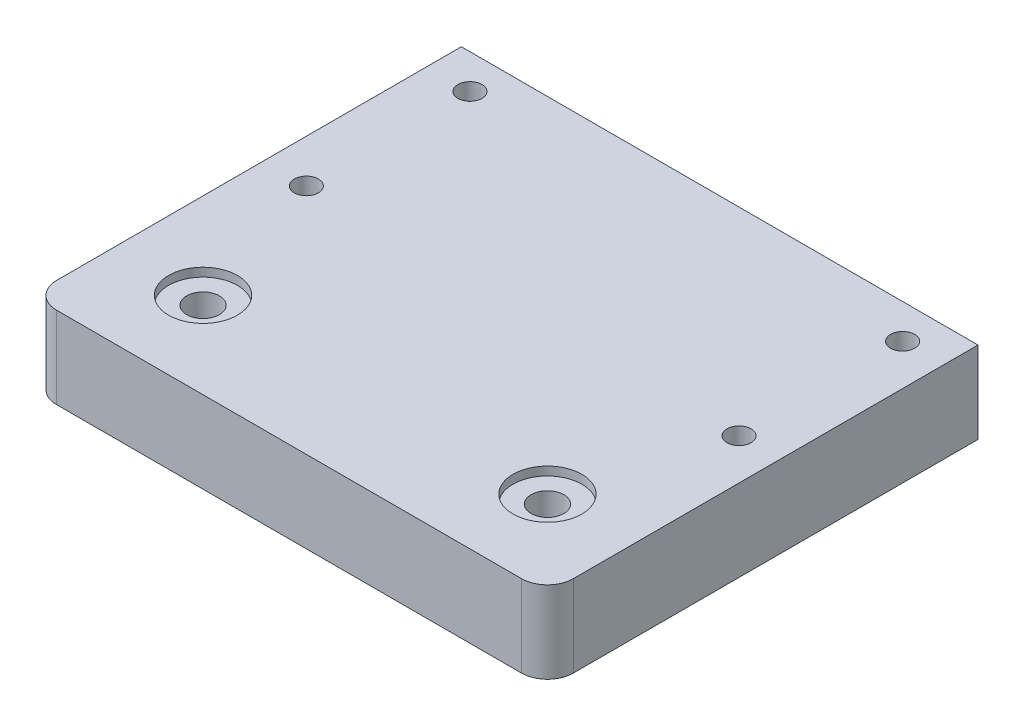
ISO-10303-21;
HEADER;
FILE_DESCRIPTION(('STEP AP214'),'2;1');
FILE_NAME('part.step','',(''),(''),'','','');
FILE_SCHEMA(('AUTOMOTIVE_DESIGN { 1 0 10303 214 1 1 1 1 }'));
ENDSEC;
DATA;
#1=APPLICATION_CONTEXT('core data for automotive mechanical design processes');
#2=APPLICATION_PROTOCOL_DEFINITION('international standard','automotive_design',2000,#1);
#3=PRODUCT_CONTEXT('',#1,'mechanical');
#4=PRODUCT('Part','Part','',(#3));
#5=PRODUCT_RELATED_PRODUCT_CATEGORY('part','',(#4));
#6=PRODUCT_DEFINITION_FORMATION('','',#4);
#7=PRODUCT_DEFINITION_CONTEXT('part definition',#1,'design');
#8=PRODUCT_DEFINITION('design','',#6,#7);
#9=PRODUCT_DEFINITION_SHAPE('','',#8);
#10=(LENGTH_UNIT() NAMED_UNIT(*) SI_UNIT(.MILLI.,.METRE.));
#11=(NAMED_UNIT(*) PLANE_ANGLE_UNIT() SI_UNIT($,.RADIAN.));
#12=(NAMED_UNIT(*) SI_UNIT($,.STERADIAN.) SOLID_ANGLE_UNIT());
#13=UNCERTAINTY_MEASURE_WITH_UNIT(LENGTH_MEASURE(1.E-05),#10,'distance_accuracy_value','');
#14=(GEOMETRIC_REPRESENTATION_CONTEXT(3) GLOBAL_UNCERTAINTY_ASSIGNED_CONTEXT((#13)) GLOBAL_UNIT_ASSIGNED_CONTEXT((#10,
#11,#12)) REPRESENTATION_CONTEXT('',''));
#15=CARTESIAN_POINT('',(0.,0.,0.));
#16=DIRECTION('',(0.,0.,1.));
#17=DIRECTION('',(1.,0.,0.));
#18=AXIS2_PLACEMENT_3D('',#15,#16,#17);
#19=CARTESIAN_POINT('',(-20.,0.,15.));
#20=DIRECTION('',(0.,1.,0.));
#21=DIRECTION('',(0.,0.,1.));
#22=AXIS2_PLACEMENT_3D('',#19,#20,#21);
#23=CYLINDRICAL_SURFACE('',#22,1.9);
#24=CARTESIAN_POINT('',(-20.,8.5,15.));
#25=DIRECTION('',(0.,1.,0.));
#26=DIRECTION('',(0.,0.,1.));
#27=AXIS2_PLACEMENT_3D('',#24,#25,#26);
#28=CIRCLE('',#27,1.9);
#29=CARTESIAN_POINT('',(-20.,8.5,16.9));
#30=VERTEX_POINT('',#29);
#31=EDGE_CURVE('E129',#30,#30,#28,.T.);
#32=ORIENTED_EDGE('',*,*,#31,.T.);
#33=EDGE_LOOP('',(#32));
#34=FACE_BOUND('',#33,.T.);
#35=CARTESIAN_POINT('',(-20.,4.,15.));
#36=DIRECTION('',(0.,-1.,0.));
#37=DIRECTION('',(0.,0.,-1.));
#38=AXIS2_PLACEMENT_3D('',#35,#36,#37);
#39=CIRCLE('',#38,1.9);
#40=CARTESIAN_POINT('',(-20.,4.,13.1));
#41=VERTEX_POINT('',#40);
#42=EDGE_CURVE('E39',#41,#41,#39,.F.);
#43=ORIENTED_EDGE('',*,*,#42,.F.);
#44=EDGE_LOOP('',(#43));
#45=FACE_BOUND('',#44,.T.);
#46=ADVANCED_FACE('F35',(#34,#45),#23,.F.);
#47=CARTESIAN_POINT('',(20.,0.,15.));
#48=DIRECTION('',(0.,1.,0.));
#49=DIRECTION('',(0.,0.,1.));
#50=AXIS2_PLACEMENT_3D('',#47,#48,#49);
#51=CYLINDRICAL_SURFACE('',#50,1.9);
#52=CARTESIAN_POINT('',(20.,8.5,15.));
#53=DIRECTION('',(0.,1.,0.));
#54=DIRECTION('',(0.,0.,1.));
#55=AXIS2_PLACEMENT_3D('',#52,#53,#54);
#56=CIRCLE('',#55,1.9);
#57=CARTESIAN_POINT('',(20.,8.5,16.9));
#58=VERTEX_POINT('',#57);
#59=EDGE_CURVE('E132',#58,#58,#56,.T.);
#60=ORIENTED_EDGE('',*,*,#59,.T.);
#61=EDGE_LOOP('',(#60));
#62=FACE_BOUND('',#61,.T.);
#63=CARTESIAN_POINT('',(20.,4.,15.));
#64=DIRECTION('',(0.,-1.,0.));
#65=DIRECTION('',(0.,0.,-1.));
#66=AXIS2_PLACEMENT_3D('',#63,#64,#65);
#67=CIRCLE('',#66,1.9);
#68=CARTESIAN_POINT('',(20.,4.,13.1));
#69=VERTEX_POINT('',#68);
#70=EDGE_CURVE('E149',#69,#69,#67,.F.);
#71=ORIENTED_EDGE('',*,*,#70,.F.);
#72=EDGE_LOOP('',(#71));
#73=FACE_BOUND('',#72,.T.);
#74=ADVANCED_FACE('F215',(#62,#73),#51,.F.);
#75=CARTESIAN_POINT('',(-25.,9.5,-21.));
#76=DIRECTION('',(0.,-1.,0.));
#77=DIRECTION('',(0.,0.,-1.));
#78=AXIS2_PLACEMENT_3D('',#75,#76,#77);
#79=CYLINDRICAL_SURFACE('',#78,1.4);
#80=CARTESIAN_POINT('',(-25.,9.5,-21.));
#81=DIRECTION('',(0.,-1.,0.));
#82=DIRECTION('',(0.,0.,-1.));
#83=AXIS2_PLACEMENT_3D('',#80,#81,#82);
#84=CIRCLE('',#83,1.4);
#85=CARTESIAN_POINT('',(-25.,9.5,-22.4));
#86=VERTEX_POINT('',#85);
#87=EDGE_CURVE('E133',#86,#86,#84,.T.);
#88=ORIENTED_EDGE('',*,*,#87,.F.);
#89=EDGE_LOOP('',(#88));
#90=FACE_BOUND('',#89,.T.);
#91=CARTESIAN_POINT('',(-25.,4.,-21.));
#92=DIRECTION('',(0.,-1.,0.));
#93=DIRECTION('',(0.,0.,-1.));
#94=AXIS2_PLACEMENT_3D('',#91,#92,#93);
#95=CIRCLE('',#94,1.4);
#96=CARTESIAN_POINT('',(-25.,4.,-22.4));
#97=VERTEX_POINT('',#96);
#98=EDGE_CURVE('E147',#97,#97,#95,.F.);
#99=ORIENTED_EDGE('',*,*,#98,.F.);
#100=EDGE_LOOP('',(#99));
#101=FACE_BOUND('',#100,.T.);
#102=ADVANCED_FACE('F221',(#90,#101),#79,.F.);
#103=CARTESIAN_POINT('',(25.25,9.5,-2.));
#104=DIRECTION('',(0.,-1.,0.));
#105=DIRECTION('',(0.,0.,-1.));
#106=AXIS2_PLACEMENT_3D('',#103,#104,#105);
#107=CYLINDRICAL_SURFACE('',#106,1.4);
#108=CARTESIAN_POINT('',(25.25,9.5,-2.));
#109=DIRECTION('',(0.,-1.,0.));
#110=DIRECTION('',(0.,0.,-1.));
#111=AXIS2_PLACEMENT_3D('',#108,#109,#110);
#112=CIRCLE('',#111,1.4);
#113=CARTESIAN_POINT('',(25.25,9.5,-3.4));
#114=VERTEX_POINT('',#113);
#115=EDGE_CURVE('E154',#114,#114,#112,.T.);
#116=ORIENTED_EDGE('',*,*,#115,.F.);
#117=EDGE_LOOP('',(#116));
#118=FACE_BOUND('',#117,.T.);
#119=CARTESIAN_POINT('',(25.25,4.,-2.));
#120=DIRECTION('',(0.,-1.,0.));
#121=DIRECTION('',(0.,0.,-1.));
#122=AXIS2_PLACEMENT_3D('',#119,#120,#121);
#123=CIRCLE('',#122,1.4);
#124=CARTESIAN_POINT('',(25.25,4.,-3.4));
#125=VERTEX_POINT('',#124);
#126=EDGE_CURVE('E144',#125,#125,#123,.F.);
#127=ORIENTED_EDGE('',*,*,#126,.F.);
#128=EDGE_LOOP('',(#127));
#129=FACE_BOUND('',#128,.T.);
#130=ADVANCED_FACE('F263',(#118,#129),#107,.F.);
#131=CARTESIAN_POINT('',(25.25,9.5,-21.));
#132=DIRECTION('',(0.,-1.,0.));
#133=DIRECTION('',(0.,0.,-1.));
#134=AXIS2_PLACEMENT_3D('',#131,#132,#133);
#135=CYLINDRICAL_SURFACE('',#134,1.4);
#136=CARTESIAN_POINT('',(25.25,9.5,-21.));
#137=DIRECTION('',(0.,-1.,0.));
#138=DIRECTION('',(0.,0.,-1.));
#139=AXIS2_PLACEMENT_3D('',#136,#137,#138);
#140=CIRCLE('',#139,1.4);
#141=CARTESIAN_POINT('',(25.25,9.5,-22.4));
#142=VERTEX_POINT('',#141);
#143=EDGE_CURVE('E158',#142,#142,#140,.T.);
#144=ORIENTED_EDGE('',*,*,#143,.F.);
#145=EDGE_LOOP('',(#144));
#146=FACE_BOUND('',#145,.T.);
#147=CARTESIAN_POINT('',(25.25,4.,-21.));
#148=DIRECTION('',(0.,-1.,0.));
#149=DIRECTION('',(0.,0.,-1.));
#150=AXIS2_PLACEMENT_3D('',#147,#148,#149);
#151=CIRCLE('',#150,1.4);
#152=CARTESIAN_POINT('',(25.25,4.,-22.4));
#153=VERTEX_POINT('',#152);
#154=EDGE_CURVE('E140',#153,#153,#151,.F.);
#155=ORIENTED_EDGE('',*,*,#154,.F.);
#156=EDGE_LOOP('',(#155));
#157=FACE_BOUND('',#156,.T.);
#158=ADVANCED_FACE('F257',(#146,#157),#135,.F.);
#159=CARTESIAN_POINT('',(-25.,9.5,-1.99999999999999));
#160=DIRECTION('',(0.,-1.,0.));
#161=DIRECTION('',(0.,0.,-1.));
#162=AXIS2_PLACEMENT_3D('',#159,#160,#161);
#163=CYLINDRICAL_SURFACE('',#162,1.4);
#164=CARTESIAN_POINT('',(-25.,9.5,-1.99999999999999));
#165=DIRECTION('',(0.,-1.,0.));
#166=DIRECTION('',(0.,0.,-1.));
#167=AXIS2_PLACEMENT_3D('',#164,#165,#166);
#168=CIRCLE('',#167,1.4);
#169=CARTESIAN_POINT('',(-25.,9.5,-3.39999999999999));
#170=VERTEX_POINT('',#169);
#171=EDGE_CURVE('E163',#170,#170,#168,.T.);
#172=ORIENTED_EDGE('',*,*,#171,.F.);
#173=EDGE_LOOP('',(#172));
#174=FACE_BOUND('',#173,.T.);
#175=CARTESIAN_POINT('',(-25.,4.,-1.99999999999999));
#176=DIRECTION('',(0.,-1.,0.));
#177=DIRECTION('',(0.,0.,-1.));
#178=AXIS2_PLACEMENT_3D('',#175,#176,#177);
#179=CIRCLE('',#178,1.4);
#180=CARTESIAN_POINT('',(-25.,4.,-3.39999999999999));
#181=VERTEX_POINT('',#180);
#182=EDGE_CURVE('E137',#181,#181,#179,.F.);
#183=ORIENTED_EDGE('',*,*,#182,.F.);
#184=EDGE_LOOP('',(#183));
#185=FACE_BOUND('',#184,.T.);
#186=ADVANCED_FACE('F253',(#174,#185),#163,.F.);
#187=CARTESIAN_POINT('',(30.,9.5,-25.));
#188=DIRECTION('',(-1.,0.,0.));
#189=DIRECTION('',(0.,0.,1.));
#190=AXIS2_PLACEMENT_3D('',#187,#188,#189);
#191=PLANE('',#190);
#192=DIRECTION('',(0.,0.,-1.));
#193=VECTOR('',#192,1.);
#194=CARTESIAN_POINT('',(30.,9.5,-25.));
#195=LINE('',#194,#193);
#196=CARTESIAN_POINT('',(30.,9.5,22.));
#197=VERTEX_POINT('',#196);
#198=CARTESIAN_POINT('',(30.,9.5,-25.));
#199=VERTEX_POINT('',#198);
#200=EDGE_CURVE('E90',#197,#199,#195,.T.);
#201=ORIENTED_EDGE('',*,*,#200,.F.);
#202=DIRECTION('',(0.,-1.,0.));
#203=VECTOR('',#202,1.);
#204=CARTESIAN_POINT('',(30.,9.5,22.));
#205=LINE('',#204,#203);
#206=CARTESIAN_POINT('',(30.,0.,22.));
#207=VERTEX_POINT('',#206);
#208=EDGE_CURVE('E11',#197,#207,#205,.T.);
#209=ORIENTED_EDGE('',*,*,#208,.T.);
#210=DIRECTION('',(0.,0.,-1.));
#211=VECTOR('',#210,1.);
#212=CARTESIAN_POINT('',(30.,0.,-25.));
#213=LINE('',#212,#211);
#214=CARTESIAN_POINT('',(30.,0.,-25.));
#215=VERTEX_POINT('',#214);
#216=EDGE_CURVE('E110',#207,#215,#213,.T.);
#217=ORIENTED_EDGE('',*,*,#216,.T.);
#218=DIRECTION('',(0.,-1.,0.));
#219=VECTOR('',#218,1.);
#220=CARTESIAN_POINT('',(30.,9.5,-25.));
#221=LINE('',#220,#219);
#222=EDGE_CURVE('E103',#199,#215,#221,.T.);
#223=ORIENTED_EDGE('',*,*,#222,.F.);
#224=EDGE_LOOP('',(#201,#209,#217,#223));
#225=FACE_BOUND('',#224,.T.);
#226=ADVANCED_FACE('F108',(#225),#191,.F.);
#227=CARTESIAN_POINT('',(-30.,9.5,-25.));
#228=DIRECTION('',(0.,0.,1.));
#229=DIRECTION('',(1.,0.,0.));
#230=AXIS2_PLACEMENT_3D('',#227,#228,#229);
#231=PLANE('',#230);
#232=DIRECTION('',(-1.,0.,0.));
#233=VECTOR('',#232,1.);
#234=CARTESIAN_POINT('',(-30.,0.,-25.));
#235=LINE('',#234,#233);
#236=CARTESIAN_POINT('',(-30.,0.,-25.));
#237=VERTEX_POINT('',#236);
#238=EDGE_CURVE('E187',#215,#237,#235,.T.);
#239=ORIENTED_EDGE('',*,*,#238,.T.);
#240=DIRECTION('',(0.,-1.,0.));
#241=VECTOR('',#240,1.);
#242=CARTESIAN_POINT('',(-30.,9.5,-25.));
#243=LINE('',#242,#241);
#244=CARTESIAN_POINT('',(-30.,9.5,-25.));
#245=VERTEX_POINT('',#244);
#246=EDGE_CURVE('E105',#245,#237,#243,.T.);
#247=ORIENTED_EDGE('',*,*,#246,.F.);
#248=DIRECTION('',(-1.,0.,0.));
#249=VECTOR('',#248,1.);
#250=CARTESIAN_POINT('',(-30.,9.5,-25.));
#251=LINE('',#250,#249);
#252=EDGE_CURVE('E93',#199,#245,#251,.T.);
#253=ORIENTED_EDGE('',*,*,#252,.F.);
#254=ORIENTED_EDGE('',*,*,#222,.T.);
#255=EDGE_LOOP('',(#239,#247,#253,#254));
#256=FACE_BOUND('',#255,.T.);
#257=ADVANCED_FACE('F102',(#256),#231,.F.);
#258=CARTESIAN_POINT('',(-30.,9.5,-25.));
#259=DIRECTION('',(1.,0.,0.));
#260=DIRECTION('',(0.,0.,-1.));
#261=AXIS2_PLACEMENT_3D('',#258,#259,#260);
#262=PLANE('',#261);
#263=DIRECTION('',(0.,0.,1.));
#264=VECTOR('',#263,1.);
#265=CARTESIAN_POINT('',(-30.,0.,-25.));
#266=LINE('',#265,#264);
#267=CARTESIAN_POINT('',(-30.,0.,22.));
#268=VERTEX_POINT('',#267);
#269=EDGE_CURVE('E189',#237,#268,#266,.T.);
#270=ORIENTED_EDGE('',*,*,#269,.T.);
#271=DIRECTION('',(0.,-1.,0.));
#272=VECTOR('',#271,1.);
#273=CARTESIAN_POINT('',(-30.,9.5,22.));
#274=LINE('',#273,#272);
#275=CARTESIAN_POINT('',(-30.,9.5,22.));
#276=VERTEX_POINT('',#275);
#277=EDGE_CURVE('E60',#268,#276,#274,.F.);
#278=ORIENTED_EDGE('',*,*,#277,.T.);
#279=DIRECTION('',(0.,0.,1.));
#280=VECTOR('',#279,1.);
#281=CARTESIAN_POINT('',(-30.,9.5,-25.));
#282=LINE('',#281,#280);
#283=EDGE_CURVE('E106',#245,#276,#282,.T.);
#284=ORIENTED_EDGE('',*,*,#283,.F.);
#285=ORIENTED_EDGE('',*,*,#246,.T.);
#286=EDGE_LOOP('',(#270,#278,#284,#285));
#287=FACE_BOUND('',#286,.T.);
#288=ADVANCED_FACE('F201',(#287),#262,.F.);
#289=CARTESIAN_POINT('',(-30.,9.5,25.));
#290=DIRECTION('',(0.,0.,-1.));
#291=DIRECTION('',(-1.,0.,0.));
#292=AXIS2_PLACEMENT_3D('',#289,#290,#291);
#293=PLANE('',#292);
#294=DIRECTION('',(1.,0.,0.));
#295=VECTOR('',#294,1.);
#296=CARTESIAN_POINT('',(-30.,9.5,25.));
#297=LINE('',#296,#295);
#298=CARTESIAN_POINT('',(-27.,9.5,25.));
#299=VERTEX_POINT('',#298);
#300=CARTESIAN_POINT('',(27.,9.5,25.));
#301=VERTEX_POINT('',#300);
#302=EDGE_CURVE('E116',#299,#301,#297,.T.);
#303=ORIENTED_EDGE('',*,*,#302,.F.);
#304=DIRECTION('',(0.,-1.,0.));
#305=VECTOR('',#304,1.);
#306=CARTESIAN_POINT('',(-27.,9.5,25.));
#307=LINE('',#306,#305);
#308=CARTESIAN_POINT('',(-27.,0.,25.));
#309=VERTEX_POINT('',#308);
#310=EDGE_CURVE('E114',#299,#309,#307,.T.);
#311=ORIENTED_EDGE('',*,*,#310,.T.);
#312=DIRECTION('',(1.,0.,0.));
#313=VECTOR('',#312,1.);
#314=CARTESIAN_POINT('',(-30.,0.,25.));
#315=LINE('',#314,#313);
#316=CARTESIAN_POINT('',(27.,0.,25.));
#317=VERTEX_POINT('',#316);
#318=EDGE_CURVE('E98',#309,#317,#315,.T.);
#319=ORIENTED_EDGE('',*,*,#318,.T.);
#320=DIRECTION('',(0.,-1.,0.));
#321=VECTOR('',#320,1.);
#322=CARTESIAN_POINT('',(27.,9.5,25.));
#323=LINE('',#322,#321);
#324=EDGE_CURVE('E112',#317,#301,#323,.F.);
#325=ORIENTED_EDGE('',*,*,#324,.T.);
#326=EDGE_LOOP('',(#303,#311,#319,#325));
#327=FACE_BOUND('',#326,.T.);
#328=ADVANCED_FACE('F195',(#327),#293,.F.);
#329=CARTESIAN_POINT('',(0.,9.5,0.));
#330=DIRECTION('',(0.,1.,0.));
#331=DIRECTION('',(0.,0.,1.));
#332=AXIS2_PLACEMENT_3D('',#329,#330,#331);
#333=PLANE('',#332);
#334=ORIENTED_EDGE('',*,*,#171,.T.);
#335=EDGE_LOOP('',(#334));
#336=FACE_BOUND('',#335,.T.);
#337=ORIENTED_EDGE('',*,*,#143,.T.);
#338=EDGE_LOOP('',(#337));
#339=FACE_BOUND('',#338,.T.);
#340=ORIENTED_EDGE('',*,*,#115,.T.);
#341=EDGE_LOOP('',(#340));
#342=FACE_BOUND('',#341,.T.);
#343=ORIENTED_EDGE('',*,*,#87,.T.);
#344=EDGE_LOOP('',(#343));
#345=FACE_BOUND('',#344,.T.);
#346=CARTESIAN_POINT('',(-20.,9.5,15.));
#347=DIRECTION('',(0.,1.,0.));
#348=DIRECTION('',(0.,0.,1.));
#349=AXIS2_PLACEMENT_3D('',#346,#347,#348);
#350=CIRCLE('',#349,4.);
#351=CARTESIAN_POINT('',(-20.,9.5,19.));
#352=VERTEX_POINT('',#351);
#353=EDGE_CURVE('E173',#352,#352,#350,.T.);
#354=ORIENTED_EDGE('',*,*,#353,.F.);
#355=EDGE_LOOP('',(#354));
#356=FACE_BOUND('',#355,.T.);
#357=CARTESIAN_POINT('',(20.,9.5,15.));
#358=DIRECTION('',(0.,1.,0.));
#359=DIRECTION('',(0.,0.,1.));
#360=AXIS2_PLACEMENT_3D('',#357,#358,#359);
#361=CIRCLE('',#360,4.);
#362=CARTESIAN_POINT('',(20.,9.5,19.));
#363=VERTEX_POINT('',#362);
#364=EDGE_CURVE('E176',#363,#363,#361,.T.);
#365=ORIENTED_EDGE('',*,*,#364,.F.);
#366=EDGE_LOOP('',(#365));
#367=FACE_BOUND('',#366,.T.);
#368=ORIENTED_EDGE('',*,*,#283,.T.);
#369=CARTESIAN_POINT('',(-27.,9.5,22.));
#370=DIRECTION('',(0.,1.,0.));
#371=DIRECTION('',(0.,0.,1.));
#372=AXIS2_PLACEMENT_3D('',#369,#370,#371);
#373=CIRCLE('',#372,3.);
#374=EDGE_CURVE('E44',#276,#299,#373,.T.);
#375=ORIENTED_EDGE('',*,*,#374,.T.);
#376=ORIENTED_EDGE('',*,*,#302,.T.);
#377=CARTESIAN_POINT('',(27.,9.5,22.));
#378=DIRECTION('',(0.,1.,0.));
#379=DIRECTION('',(0.,0.,1.));
#380=AXIS2_PLACEMENT_3D('',#377,#378,#379);
#381=CIRCLE('',#380,3.);
#382=EDGE_CURVE('E52',#301,#197,#381,.T.);
#383=ORIENTED_EDGE('',*,*,#382,.T.);
#384=ORIENTED_EDGE('',*,*,#200,.T.);
#385=ORIENTED_EDGE('',*,*,#252,.T.);
#386=EDGE_LOOP('',(#368,#375,#376,#383,#384,#385));
#387=FACE_BOUND('',#386,.T.);
#388=ADVANCED_FACE('F92',(#336,#339,#342,#345,#356,#367,#387),#333,.T.);
#389=CARTESIAN_POINT('',(0.,0.,0.));
#390=DIRECTION('',(0.,1.,0.));
#391=DIRECTION('',(0.,0.,1.));
#392=AXIS2_PLACEMENT_3D('',#389,#390,#391);
#393=PLANE('',#392);
#394=CARTESIAN_POINT('',(20.,0.,15.));
#395=DIRECTION('',(0.,-1.,0.));
#396=DIRECTION('',(0.,0.,-1.));
#397=AXIS2_PLACEMENT_3D('',#394,#395,#396);
#398=CIRCLE('',#397,4.);
#399=CARTESIAN_POINT('',(20.,0.,11.));
#400=VERTEX_POINT('',#399);
#401=EDGE_CURVE('E336',#400,#400,#398,.T.);
#402=ORIENTED_EDGE('',*,*,#401,.F.);
#403=EDGE_LOOP('',(#402));
#404=FACE_BOUND('',#403,.T.);
#405=CARTESIAN_POINT('',(25.25,0.,-2.));
#406=DIRECTION('',(0.,-1.,0.));
#407=DIRECTION('',(0.,0.,-1.));
#408=AXIS2_PLACEMENT_3D('',#405,#406,#407);
#409=CIRCLE('',#408,3.);
#410=CARTESIAN_POINT('',(25.25,0.,-5.));
#411=VERTEX_POINT('',#410);
#412=EDGE_CURVE('E342',#411,#411,#409,.T.);
#413=ORIENTED_EDGE('',*,*,#412,.F.);
#414=EDGE_LOOP('',(#413));
#415=FACE_BOUND('',#414,.T.);
#416=CARTESIAN_POINT('',(25.25,0.,-21.));
#417=DIRECTION('',(0.,-1.,0.));
#418=DIRECTION('',(0.,0.,-1.));
#419=AXIS2_PLACEMENT_3D('',#416,#417,#418);
#420=CIRCLE('',#419,3.);
#421=CARTESIAN_POINT('',(25.25,0.,-24.));
#422=VERTEX_POINT('',#421);
#423=EDGE_CURVE('E348',#422,#422,#420,.T.);
#424=ORIENTED_EDGE('',*,*,#423,.F.);
#425=EDGE_LOOP('',(#424));
#426=FACE_BOUND('',#425,.T.);
#427=CARTESIAN_POINT('',(-25.,0.,-21.));
#428=DIRECTION('',(0.,-1.,0.));
#429=DIRECTION('',(0.,0.,-1.));
#430=AXIS2_PLACEMENT_3D('',#427,#428,#429);
#431=CIRCLE('',#430,3.);
#432=CARTESIAN_POINT('',(-25.,0.,-24.));
#433=VERTEX_POINT('',#432);
#434=EDGE_CURVE('E324',#433,#433,#431,.T.);
#435=ORIENTED_EDGE('',*,*,#434,.F.);
#436=EDGE_LOOP('',(#435));
#437=FACE_BOUND('',#436,.T.);
#438=CARTESIAN_POINT('',(-25.,0.,-1.99999999999999));
#439=DIRECTION('',(0.,-1.,0.));
#440=DIRECTION('',(0.,0.,-1.));
#441=AXIS2_PLACEMENT_3D('',#438,#439,#440);
#442=CIRCLE('',#441,3.);
#443=CARTESIAN_POINT('',(-25.,0.,-4.99999999999999));
#444=VERTEX_POINT('',#443);
#445=EDGE_CURVE('E325',#444,#444,#442,.T.);
#446=ORIENTED_EDGE('',*,*,#445,.F.);
#447=EDGE_LOOP('',(#446));
#448=FACE_BOUND('',#447,.T.);
#449=CARTESIAN_POINT('',(-20.,0.,15.));
#450=DIRECTION('',(0.,-1.,0.));
#451=DIRECTION('',(0.,0.,-1.));
#452=AXIS2_PLACEMENT_3D('',#449,#450,#451);
#453=CIRCLE('',#452,4.);
#454=CARTESIAN_POINT('',(-20.,0.,11.));
#455=VERTEX_POINT('',#454);
#456=EDGE_CURVE('E167',#455,#455,#453,.T.);
#457=ORIENTED_EDGE('',*,*,#456,.F.);
#458=EDGE_LOOP('',(#457));
#459=FACE_BOUND('',#458,.T.);
#460=ORIENTED_EDGE('',*,*,#318,.F.);
#461=CARTESIAN_POINT('',(-27.,0.,22.));
#462=DIRECTION('',(0.,1.,0.));
#463=DIRECTION('',(0.,0.,1.));
#464=AXIS2_PLACEMENT_3D('',#461,#462,#463);
#465=CIRCLE('',#464,3.);
#466=EDGE_CURVE('E124',#309,#268,#465,.F.);
#467=ORIENTED_EDGE('',*,*,#466,.T.);
#468=ORIENTED_EDGE('',*,*,#269,.F.);
#469=ORIENTED_EDGE('',*,*,#238,.F.);
#470=ORIENTED_EDGE('',*,*,#216,.F.);
#471=CARTESIAN_POINT('',(27.,0.,22.));
#472=DIRECTION('',(0.,1.,0.));
#473=DIRECTION('',(0.,0.,1.));
#474=AXIS2_PLACEMENT_3D('',#471,#472,#473);
#475=CIRCLE('',#474,3.);
#476=EDGE_CURVE('E122',#207,#317,#475,.F.);
#477=ORIENTED_EDGE('',*,*,#476,.T.);
#478=EDGE_LOOP('',(#460,#467,#468,#469,#470,#477));
#479=FACE_BOUND('',#478,.T.);
#480=ADVANCED_FACE('F199',(#404,#415,#426,#437,#448,#459,#479),#393,.F.);
#481=CARTESIAN_POINT('',(-27.,9.5,22.));
#482=DIRECTION('',(0.,-1.,0.));
#483=DIRECTION('',(0.,0.,-1.));
#484=AXIS2_PLACEMENT_3D('',#481,#482,#483);
#485=CYLINDRICAL_SURFACE('',#484,3.);
#486=ORIENTED_EDGE('',*,*,#374,.F.);
#487=ORIENTED_EDGE('',*,*,#277,.F.);
#488=ORIENTED_EDGE('',*,*,#466,.F.);
#489=ORIENTED_EDGE('',*,*,#310,.F.);
#490=EDGE_LOOP('',(#486,#487,#488,#489));
#491=FACE_BOUND('',#490,.T.);
#492=ADVANCED_FACE('F204',(#491),#485,.T.);
#493=CARTESIAN_POINT('',(27.,9.5,22.));
#494=DIRECTION('',(0.,-1.,0.));
#495=DIRECTION('',(0.,0.,-1.));
#496=AXIS2_PLACEMENT_3D('',#493,#494,#495);
#497=CYLINDRICAL_SURFACE('',#496,3.);
#498=ORIENTED_EDGE('',*,*,#382,.F.);
#499=ORIENTED_EDGE('',*,*,#324,.F.);
#500=ORIENTED_EDGE('',*,*,#476,.F.);
#501=ORIENTED_EDGE('',*,*,#208,.F.);
#502=EDGE_LOOP('',(#498,#499,#500,#501));
#503=FACE_BOUND('',#502,.T.);
#504=ADVANCED_FACE('F37',(#503),#497,.T.);
#505=CARTESIAN_POINT('',(20.,8.5,15.));
#506=DIRECTION('',(0.,1.,0.));
#507=DIRECTION('',(0.,0.,1.));
#508=AXIS2_PLACEMENT_3D('',#505,#506,#507);
#509=CYLINDRICAL_SURFACE('',#508,4.);
#510=CARTESIAN_POINT('',(20.,8.5,15.));
#511=DIRECTION('',(0.,1.,0.));
#512=DIRECTION('',(0.,0.,1.));
#513=AXIS2_PLACEMENT_3D('',#510,#511,#512);
#514=CIRCLE('',#513,4.);
#515=CARTESIAN_POINT('',(20.,8.5,19.));
#516=VERTEX_POINT('',#515);
#517=EDGE_CURVE('E179',#516,#516,#514,.T.);
#518=ORIENTED_EDGE('',*,*,#517,.F.);
#519=EDGE_LOOP('',(#518));
#520=FACE_BOUND('',#519,.T.);
#521=ORIENTED_EDGE('',*,*,#364,.T.);
#522=EDGE_LOOP('',(#521));
#523=FACE_BOUND('',#522,.T.);
#524=ADVANCED_FACE('F210',(#520,#523),#509,.F.);
#525=CARTESIAN_POINT('',(20.,8.5,15.));
#526=DIRECTION('',(0.,1.,0.));
#527=DIRECTION('',(0.,0.,1.));
#528=AXIS2_PLACEMENT_3D('',#525,#526,#527);
#529=PLANE('',#528);
#530=ORIENTED_EDGE('',*,*,#59,.F.);
#531=EDGE_LOOP('',(#530));
#532=FACE_BOUND('',#531,.T.);
#533=ORIENTED_EDGE('',*,*,#517,.T.);
#534=EDGE_LOOP('',(#533));
#535=FACE_BOUND('',#534,.T.);
#536=ADVANCED_FACE('F232',(#532,#535),#529,.T.);
#537=CARTESIAN_POINT('',(-20.,8.5,15.));
#538=DIRECTION('',(0.,1.,0.));
#539=DIRECTION('',(0.,0.,1.));
#540=AXIS2_PLACEMENT_3D('',#537,#538,#539);
#541=CYLINDRICAL_SURFACE('',#540,4.);
#542=CARTESIAN_POINT('',(-20.,8.5,15.));
#543=DIRECTION('',(0.,1.,0.));
#544=DIRECTION('',(0.,0.,1.));
#545=AXIS2_PLACEMENT_3D('',#542,#543,#544);
#546=CIRCLE('',#545,4.);
#547=CARTESIAN_POINT('',(-20.,8.5,19.));
#548=VERTEX_POINT('',#547);
#549=EDGE_CURVE('E136',#548,#548,#546,.T.);
#550=ORIENTED_EDGE('',*,*,#549,.F.);
#551=EDGE_LOOP('',(#550));
#552=FACE_BOUND('',#551,.T.);
#553=ORIENTED_EDGE('',*,*,#353,.T.);
#554=EDGE_LOOP('',(#553));
#555=FACE_BOUND('',#554,.T.);
#556=ADVANCED_FACE('F228',(#552,#555),#541,.F.);
#557=CARTESIAN_POINT('',(-20.,8.5,15.));
#558=DIRECTION('',(0.,1.,0.));
#559=DIRECTION('',(0.,0.,1.));
#560=AXIS2_PLACEMENT_3D('',#557,#558,#559);
#561=PLANE('',#560);
#562=ORIENTED_EDGE('',*,*,#31,.F.);
#563=EDGE_LOOP('',(#562));
#564=FACE_BOUND('',#563,.T.);
#565=ORIENTED_EDGE('',*,*,#549,.T.);
#566=EDGE_LOOP('',(#565));
#567=FACE_BOUND('',#566,.T.);
#568=ADVANCED_FACE('F231',(#564,#567),#561,.T.);
#569=CARTESIAN_POINT('',(-25.,4.,-1.99999999999999));
#570=DIRECTION('',(0.,-1.,0.));
#571=DIRECTION('',(0.,0.,-1.));
#572=AXIS2_PLACEMENT_3D('',#569,#570,#571);
#573=PLANE('',#572);
#574=CARTESIAN_POINT('',(-25.,4.,-1.99999999999999));
#575=DIRECTION('',(0.,-1.,0.));
#576=DIRECTION('',(0.,0.,-1.));
#577=AXIS2_PLACEMENT_3D('',#574,#575,#576);
#578=CIRCLE('',#577,3.);
#579=CARTESIAN_POINT('',(-25.,4.,-4.99999999999999));
#580=VERTEX_POINT('',#579);
#581=EDGE_CURVE('E322',#580,#580,#578,.T.);
#582=ORIENTED_EDGE('',*,*,#581,.T.);
#583=EDGE_LOOP('',(#582));
#584=FACE_BOUND('',#583,.T.);
#585=ORIENTED_EDGE('',*,*,#182,.T.);
#586=EDGE_LOOP('',(#585));
#587=FACE_BOUND('',#586,.T.);
#588=ADVANCED_FACE('F236',(#584,#587),#573,.T.);
#589=CARTESIAN_POINT('',(-25.,4.,-1.99999999999999));
#590=DIRECTION('',(0.,-1.,0.));
#591=DIRECTION('',(0.,0.,-1.));
#592=AXIS2_PLACEMENT_3D('',#589,#590,#591);
#593=CYLINDRICAL_SURFACE('',#592,3.);
#594=ORIENTED_EDGE('',*,*,#581,.F.);
#595=EDGE_LOOP('',(#594));
#596=FACE_BOUND('',#595,.T.);
#597=ORIENTED_EDGE('',*,*,#445,.T.);
#598=EDGE_LOOP('',(#597));
#599=FACE_BOUND('',#598,.T.);
#600=ADVANCED_FACE('F298',(#596,#599),#593,.F.);
#601=CARTESIAN_POINT('',(25.25,4.,-21.));
#602=DIRECTION('',(0.,-1.,0.));
#603=DIRECTION('',(0.,0.,-1.));
#604=AXIS2_PLACEMENT_3D('',#601,#602,#603);
#605=PLANE('',#604);
#606=CARTESIAN_POINT('',(25.25,4.,-21.));
#607=DIRECTION('',(0.,-1.,0.));
#608=DIRECTION('',(0.,0.,-1.));
#609=AXIS2_PLACEMENT_3D('',#606,#607,#608);
#610=CIRCLE('',#609,3.);
#611=CARTESIAN_POINT('',(25.25,4.,-24.));
#612=VERTEX_POINT('',#611);
#613=EDGE_CURVE('E345',#612,#612,#610,.T.);
#614=ORIENTED_EDGE('',*,*,#613,.T.);
#615=EDGE_LOOP('',(#614));
#616=FACE_BOUND('',#615,.T.);
#617=ORIENTED_EDGE('',*,*,#154,.T.);
#618=EDGE_LOOP('',(#617));
#619=FACE_BOUND('',#618,.T.);
#620=ADVANCED_FACE('F294',(#616,#619),#605,.T.);
#621=CARTESIAN_POINT('',(25.25,4.,-21.));
#622=DIRECTION('',(0.,-1.,0.));
#623=DIRECTION('',(0.,0.,-1.));
#624=AXIS2_PLACEMENT_3D('',#621,#622,#623);
#625=CYLINDRICAL_SURFACE('',#624,3.);
#626=ORIENTED_EDGE('',*,*,#613,.F.);
#627=EDGE_LOOP('',(#626));
#628=FACE_BOUND('',#627,.T.);
#629=ORIENTED_EDGE('',*,*,#423,.T.);
#630=EDGE_LOOP('',(#629));
#631=FACE_BOUND('',#630,.T.);
#632=ADVANCED_FACE('F290',(#628,#631),#625,.F.);
#633=CARTESIAN_POINT('',(25.25,4.,-2.));
#634=DIRECTION('',(0.,-1.,0.));
#635=DIRECTION('',(0.,0.,-1.));
#636=AXIS2_PLACEMENT_3D('',#633,#634,#635);
#637=PLANE('',#636);
#638=CARTESIAN_POINT('',(25.25,4.,-2.));
#639=DIRECTION('',(0.,-1.,0.));
#640=DIRECTION('',(0.,0.,-1.));
#641=AXIS2_PLACEMENT_3D('',#638,#639,#640);
#642=CIRCLE('',#641,3.);
#643=CARTESIAN_POINT('',(25.25,4.,-5.));
#644=VERTEX_POINT('',#643);
#645=EDGE_CURVE('E339',#644,#644,#642,.T.);
#646=ORIENTED_EDGE('',*,*,#645,.T.);
#647=EDGE_LOOP('',(#646));
#648=FACE_BOUND('',#647,.T.);
#649=ORIENTED_EDGE('',*,*,#126,.T.);
#650=EDGE_LOOP('',(#649));
#651=FACE_BOUND('',#650,.T.);
#652=ADVANCED_FACE('F293',(#648,#651),#637,.T.);
#653=CARTESIAN_POINT('',(25.25,4.,-2.));
#654=DIRECTION('',(0.,-1.,0.));
#655=DIRECTION('',(0.,0.,-1.));
#656=AXIS2_PLACEMENT_3D('',#653,#654,#655);
#657=CYLINDRICAL_SURFACE('',#656,3.);
#658=ORIENTED_EDGE('',*,*,#645,.F.);
#659=EDGE_LOOP('',(#658));
#660=FACE_BOUND('',#659,.T.);
#661=ORIENTED_EDGE('',*,*,#412,.T.);
#662=EDGE_LOOP('',(#661));
#663=FACE_BOUND('',#662,.T.);
#664=ADVANCED_FACE('F288',(#660,#663),#657,.F.);
#665=CARTESIAN_POINT('',(-25.,4.,-21.));
#666=DIRECTION('',(0.,-1.,0.));
#667=DIRECTION('',(0.,0.,-1.));
#668=AXIS2_PLACEMENT_3D('',#665,#666,#667);
#669=PLANE('',#668);
#670=CARTESIAN_POINT('',(-25.,4.,-21.));
#671=DIRECTION('',(0.,-1.,0.));
#672=DIRECTION('',(0.,0.,-1.));
#673=AXIS2_PLACEMENT_3D('',#670,#671,#672);
#674=CIRCLE('',#673,3.);
#675=CARTESIAN_POINT('',(-25.,4.,-24.));
#676=VERTEX_POINT('',#675);
#677=EDGE_CURVE('E328',#676,#676,#674,.T.);
#678=ORIENTED_EDGE('',*,*,#677,.T.);
#679=EDGE_LOOP('',(#678));
#680=FACE_BOUND('',#679,.T.);
#681=ORIENTED_EDGE('',*,*,#98,.T.);
#682=EDGE_LOOP('',(#681));
#683=FACE_BOUND('',#682,.T.);
#684=ADVANCED_FACE('F284',(#680,#683),#669,.T.);
#685=CARTESIAN_POINT('',(-25.,4.,-21.));
#686=DIRECTION('',(0.,-1.,0.));
#687=DIRECTION('',(0.,0.,-1.));
#688=AXIS2_PLACEMENT_3D('',#685,#686,#687);
#689=CYLINDRICAL_SURFACE('',#688,3.);
#690=ORIENTED_EDGE('',*,*,#677,.F.);
#691=EDGE_LOOP('',(#690));
#692=FACE_BOUND('',#691,.T.);
#693=ORIENTED_EDGE('',*,*,#434,.T.);
#694=EDGE_LOOP('',(#693));
#695=FACE_BOUND('',#694,.T.);
#696=ADVANCED_FACE('F280',(#692,#695),#689,.F.);
#697=CARTESIAN_POINT('',(20.,4.,15.));
#698=DIRECTION('',(0.,-1.,0.));
#699=DIRECTION('',(0.,0.,-1.));
#700=AXIS2_PLACEMENT_3D('',#697,#698,#699);
#701=PLANE('',#700);
#702=CARTESIAN_POINT('',(20.,4.,15.));
#703=DIRECTION('',(0.,-1.,0.));
#704=DIRECTION('',(0.,0.,-1.));
#705=AXIS2_PLACEMENT_3D('',#702,#703,#704);
#706=CIRCLE('',#705,4.);
#707=CARTESIAN_POINT('',(20.,4.,11.));
#708=VERTEX_POINT('',#707);
#709=EDGE_CURVE('E333',#708,#708,#706,.T.);
#710=ORIENTED_EDGE('',*,*,#709,.T.);
#711=EDGE_LOOP('',(#710));
#712=FACE_BOUND('',#711,.T.);
#713=ORIENTED_EDGE('',*,*,#70,.T.);
#714=EDGE_LOOP('',(#713));
#715=FACE_BOUND('',#714,.T.);
#716=ADVANCED_FACE('F283',(#712,#715),#701,.T.);
#717=CARTESIAN_POINT('',(20.,4.,15.));
#718=DIRECTION('',(0.,-1.,0.));
#719=DIRECTION('',(0.,0.,-1.));
#720=AXIS2_PLACEMENT_3D('',#717,#718,#719);
#721=CYLINDRICAL_SURFACE('',#720,4.);
#722=ORIENTED_EDGE('',*,*,#709,.F.);
#723=EDGE_LOOP('',(#722));
#724=FACE_BOUND('',#723,.T.);
#725=ORIENTED_EDGE('',*,*,#401,.T.);
#726=EDGE_LOOP('',(#725));
#727=FACE_BOUND('',#726,.T.);
#728=ADVANCED_FACE('F278',(#724,#727),#721,.F.);
#729=CARTESIAN_POINT('',(-20.,4.,15.));
#730=DIRECTION('',(0.,-1.,0.));
#731=DIRECTION('',(0.,0.,-1.));
#732=AXIS2_PLACEMENT_3D('',#729,#730,#731);
#733=PLANE('',#732);
#734=CARTESIAN_POINT('',(-20.,4.,15.));
#735=DIRECTION('',(0.,-1.,0.));
#736=DIRECTION('',(0.,0.,-1.));
#737=AXIS2_PLACEMENT_3D('',#734,#735,#736);
#738=CIRCLE('',#737,4.);
#739=CARTESIAN_POINT('',(-20.,4.,11.));
#740=VERTEX_POINT('',#739);
#741=EDGE_CURVE('E141',#740,#740,#738,.T.);
#742=ORIENTED_EDGE('',*,*,#741,.T.);
#743=EDGE_LOOP('',(#742));
#744=FACE_BOUND('',#743,.T.);
#745=ORIENTED_EDGE('',*,*,#42,.T.);
#746=EDGE_LOOP('',(#745));
#747=FACE_BOUND('',#746,.T.);
#748=ADVANCED_FACE('F274',(#744,#747),#733,.T.);
#749=CARTESIAN_POINT('',(-20.,4.,15.));
#750=DIRECTION('',(0.,-1.,0.));
#751=DIRECTION('',(0.,0.,-1.));
#752=AXIS2_PLACEMENT_3D('',#749,#750,#751);
#753=CYLINDRICAL_SURFACE('',#752,4.);
#754=ORIENTED_EDGE('',*,*,#741,.F.);
#755=EDGE_LOOP('',(#754));
#756=FACE_BOUND('',#755,.T.);
#757=ORIENTED_EDGE('',*,*,#456,.T.);
#758=EDGE_LOOP('',(#757));
#759=FACE_BOUND('',#758,.T.);
#760=ADVANCED_FACE('F271',(#756,#759),#753,.F.);
#761=CLOSED_SHELL('',(#46,#74,#102,#130,#158,#186,#226,#257,#288,#328,#388,#480,#492,#504,#524,
#536,#556,#568,#588,#600,#620,#632,#652,#664,#684,#696,#716,#728,#748,#760));
#762=MANIFOLD_SOLID_BREP('B2',#761);
#763=ADVANCED_BREP_SHAPE_REPRESENTATION('',(#18,#762),#14);
#764=SHAPE_DEFINITION_REPRESENTATION(#9,#763);
ENDSEC;
END-ISO-10303-21;
